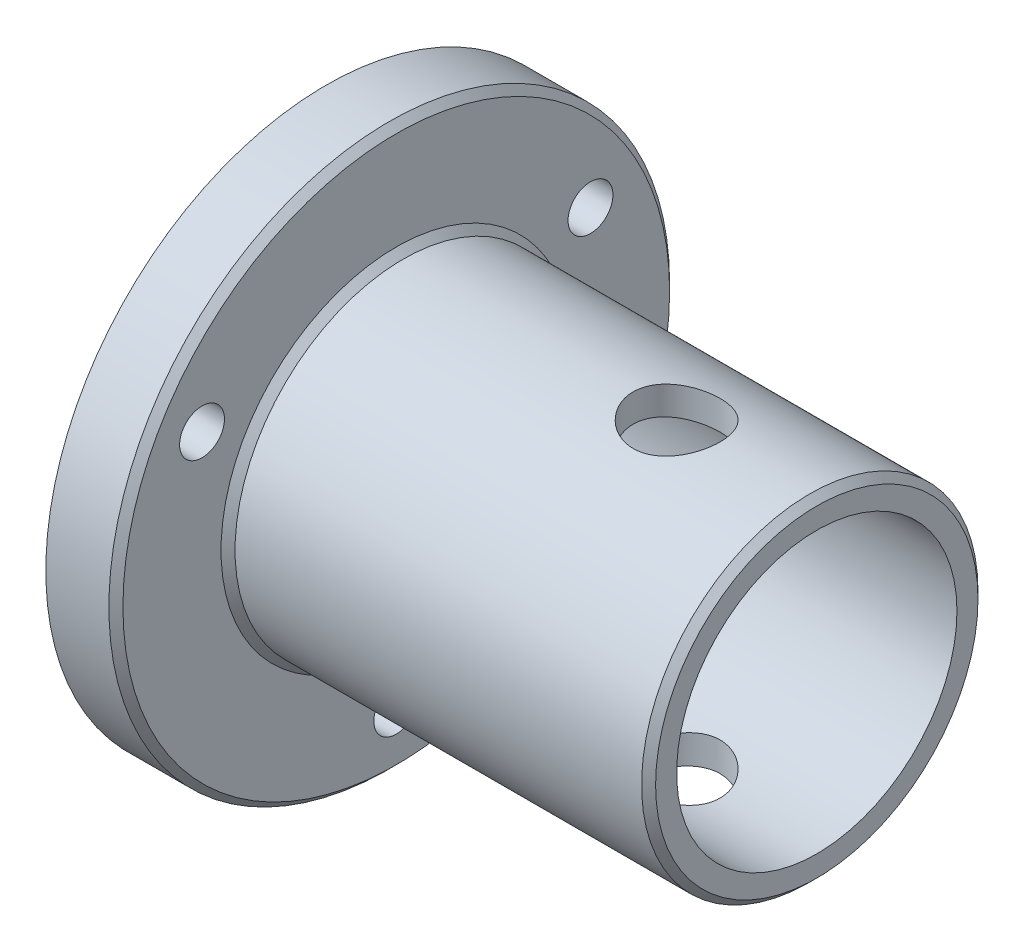
ISO-10303-21;
HEADER;
FILE_DESCRIPTION(('STEP AP214'),'2;1');
FILE_NAME('part.step','',(''),(''),'','','');
FILE_SCHEMA(('AUTOMOTIVE_DESIGN { 1 0 10303 214 1 1 1 1 }'));
ENDSEC;
DATA;
#1=APPLICATION_CONTEXT('core data for automotive mechanical design processes');
#2=APPLICATION_PROTOCOL_DEFINITION('international standard','automotive_design',2000,#1);
#3=PRODUCT_CONTEXT('',#1,'mechanical');
#4=PRODUCT('Part','Part','',(#3));
#5=PRODUCT_RELATED_PRODUCT_CATEGORY('part','',(#4));
#6=PRODUCT_DEFINITION_FORMATION('','',#4);
#7=PRODUCT_DEFINITION_CONTEXT('part definition',#1,'design');
#8=PRODUCT_DEFINITION('design','',#6,#7);
#9=PRODUCT_DEFINITION_SHAPE('','',#8);
#10=(LENGTH_UNIT() NAMED_UNIT(*) SI_UNIT(.MILLI.,.METRE.));
#11=(NAMED_UNIT(*) PLANE_ANGLE_UNIT() SI_UNIT($,.RADIAN.));
#12=(NAMED_UNIT(*) SI_UNIT($,.STERADIAN.) SOLID_ANGLE_UNIT());
#13=UNCERTAINTY_MEASURE_WITH_UNIT(LENGTH_MEASURE(1.E-05),#10,'distance_accuracy_value','');
#14=(GEOMETRIC_REPRESENTATION_CONTEXT(3) GLOBAL_UNCERTAINTY_ASSIGNED_CONTEXT((#13)) GLOBAL_UNIT_ASSIGNED_CONTEXT((#10,
#11,#12)) REPRESENTATION_CONTEXT('',''));
#15=CARTESIAN_POINT('',(0.,0.,0.));
#16=DIRECTION('',(0.,0.,1.));
#17=DIRECTION('',(1.,0.,0.));
#18=AXIS2_PLACEMENT_3D('',#15,#16,#17);
#19=CARTESIAN_POINT('',(35.,0.,0.));
#20=DIRECTION('',(-1.,0.,0.));
#21=DIRECTION('',(0.,0.,1.));
#22=AXIS2_PLACEMENT_3D('',#19,#20,#21);
#23=CYLINDRICAL_SURFACE('',#22,12.);
#24=CARTESIAN_POINT('',(5.50000000000001,0.,0.));
#25=DIRECTION('',(1.,0.,0.));
#26=DIRECTION('',(0.,0.,-1.));
#27=AXIS2_PLACEMENT_3D('',#24,#25,#26);
#28=CIRCLE('',#27,12.);
#29=CARTESIAN_POINT('',(5.50000000000001,0.,-12.));
#30=VERTEX_POINT('',#29);
#31=EDGE_CURVE('E44',#30,#30,#28,.T.);
#32=ORIENTED_EDGE('',*,*,#31,.T.);
#33=EDGE_LOOP('',(#32));
#34=FACE_BOUND('',#33,.T.);
#35=CARTESIAN_POINT('',(34.5,0.,0.));
#36=DIRECTION('',(1.,0.,0.));
#37=DIRECTION('',(0.,0.,-1.));
#38=AXIS2_PLACEMENT_3D('',#35,#36,#37);
#39=CIRCLE('',#38,12.);
#40=CARTESIAN_POINT('',(34.5,0.,-12.));
#41=VERTEX_POINT('',#40);
#42=EDGE_CURVE('E57',#41,#41,#39,.F.);
#43=ORIENTED_EDGE('',*,*,#42,.T.);
#44=EDGE_LOOP('',(#43));
#45=FACE_BOUND('',#44,.T.);
#46=CARTESIAN_POINT('',(25.,-11.5926700979541,-3.1));
#47=CARTESIAN_POINT('',(25.1709812687273,-11.5926732321222,-3.0999954912357));
#48=CARTESIAN_POINT('',(25.3420113313602,-11.5964941540659,-3.08580603872909));
#49=CARTESIAN_POINT('',(25.6791462756398,-11.611322692769,-3.02952201236185));
#50=CARTESIAN_POINT('',(25.8452484356607,-11.6223342063142,-2.9874123075328));
#51=CARTESIAN_POINT('',(26.1676021078596,-11.6502154462981,-2.8767528281645));
#52=CARTESIAN_POINT('',(26.323866564604,-11.6670772760698,-2.80823868019879));
#53=CARTESIAN_POINT('',(26.6227038965771,-11.7047492995837,-2.64682525331377));
#54=CARTESIAN_POINT('',(26.7652759501391,-11.7255597300546,-2.55392451222788));
#55=CARTESIAN_POINT('',(27.0360295916321,-11.7693315191616,-2.34404333029207));
#56=CARTESIAN_POINT('',(27.163842102149,-11.7923291195899,-2.22659423003465));
#57=CARTESIAN_POINT('',(27.3981915312794,-11.8375703908243,-1.97195898842077));
#58=CARTESIAN_POINT('',(27.5047263560674,-11.8598139872542,-1.83477090693754));
#59=CARTESIAN_POINT('',(27.695020595396,-11.9014436748245,-1.54200834198931));
#60=CARTESIAN_POINT('',(27.7784152918266,-11.9207820184585,-1.38618941543748));
#61=CARTESIAN_POINT('',(27.917687075037,-11.954007659976,-1.06216060658955));
#62=CARTESIAN_POINT('',(27.9735685063844,-11.9678958184176,-0.893952685441771));
#63=CARTESIAN_POINT('',(28.0550392473864,-11.9884000367007,-0.553770734206769));
#64=CARTESIAN_POINT('',(28.081255845454,-11.9951664669956,-0.381956155667461));
#65=CARTESIAN_POINT('',(28.1046239856346,-12.001189699885,-0.0362432207716312));
#66=CARTESIAN_POINT('',(28.1017801043448,-12.0004476849492,0.137654803164504));
#67=CARTESIAN_POINT('',(28.0675545353157,-11.9916487016588,0.478240037991099));
#68=CARTESIAN_POINT('',(28.0368502533953,-11.9837653766775,0.645000487656348));
#69=CARTESIAN_POINT('',(27.9488670322867,-11.9617730684823,0.970916767816803));
#70=CARTESIAN_POINT('',(27.8915866268404,-11.9476637417695,1.13007217819233));
#71=CARTESIAN_POINT('',(27.7515433557971,-11.9145431124111,1.43801789833881));
#72=CARTESIAN_POINT('',(27.6685438516611,-11.8954865666526,1.58669552694301));
#73=CARTESIAN_POINT('',(27.4795989672981,-11.8545318437837,1.86824666067749));
#74=CARTESIAN_POINT('',(27.3736493558522,-11.8326331429754,2.00111724451916));
#75=CARTESIAN_POINT('',(27.1381976920348,-11.7876283841855,2.25132438640943));
#76=CARTESIAN_POINT('',(27.0081042125355,-11.7645057211298,2.3681020323851));
#77=CARTESIAN_POINT('',(26.7299394465306,-11.7202333748904,2.57831380162861));
#78=CARTESIAN_POINT('',(26.5818671990644,-11.6990837972746,2.67174667630737));
#79=CARTESIAN_POINT('',(26.270795044652,-11.6610891819864,2.8330075364046));
#80=CARTESIAN_POINT('',(26.1077178096527,-11.6442683584863,2.90069245894728));
#81=CARTESIAN_POINT('',(25.7719576007214,-11.6171413090202,3.00750695874671));
#82=CARTESIAN_POINT('',(25.599276851601,-11.6068335809725,3.04664312037952));
#83=CARTESIAN_POINT('',(25.254416284425,-11.5942174237512,3.09430407740065));
#84=CARTESIAN_POINT('',(25.0823589764788,-11.5916921633405,3.10365887749602));
#85=CARTESIAN_POINT('',(24.7391401147316,-11.5943351499617,3.09377102744816));
#86=CARTESIAN_POINT('',(24.5679784738847,-11.5995026348923,3.07453121010369));
#87=CARTESIAN_POINT('',(24.2345484619628,-11.6167402601914,3.00873001478412));
#88=CARTESIAN_POINT('',(24.0721761697032,-11.6286862698099,2.96265957932974));
#89=CARTESIAN_POINT('',(23.7574610922742,-11.6580153953549,2.84505301580562));
#90=CARTESIAN_POINT('',(23.6051195589164,-11.6753991883511,2.77351371640119));
#91=CARTESIAN_POINT('',(23.3112953954056,-11.7140960291964,2.60528870310117));
#92=CARTESIAN_POINT('',(23.1701043789401,-11.735483254687,2.50811110154685));
#93=CARTESIAN_POINT('',(22.9057284588905,-11.7795988823168,2.2919839065464));
#94=CARTESIAN_POINT('',(22.782546730782,-11.8023275199903,2.1730304818004));
#95=CARTESIAN_POINT('',(22.5542829216208,-11.8473056159507,1.91290429530348));
#96=CARTESIAN_POINT('',(22.4497773110176,-11.86952570636,1.77121961861856));
#97=CARTESIAN_POINT('',(22.2660380700746,-11.9103524913061,1.47183340500616));
#98=CARTESIAN_POINT('',(22.1868031031189,-11.9289593769324,1.31413271578014));
#99=CARTESIAN_POINT('',(22.0565633389923,-11.9603442961819,0.988294681062561));
#100=CARTESIAN_POINT('',(22.0053511266874,-11.9731650294859,0.820244550200718));
#101=CARTESIAN_POINT('',(21.9319975894284,-11.991720545072,0.477545654715656));
#102=CARTESIAN_POINT('',(21.9098502465951,-11.9974567941815,0.302898263761298));
#103=CARTESIAN_POINT('',(21.895612710381,-12.0011325126361,-0.0426369024851989));
#104=CARTESIAN_POINT('',(21.9026743542239,-11.9992920014047,-0.213487900899179));
#105=CARTESIAN_POINT('',(21.9446985165505,-11.9885136629736,-0.551482300379906));
#106=CARTESIAN_POINT('',(21.9796601002656,-11.9795760735567,-0.718625825470205));
#107=CARTESIAN_POINT('',(22.0760243598104,-11.9556466521864,-1.04350746562916));
#108=CARTESIAN_POINT('',(22.1372644025869,-11.9406920931933,-1.20129674565794));
#109=CARTESIAN_POINT('',(22.284301037089,-11.9062979087882,-1.50445044483574));
#110=CARTESIAN_POINT('',(22.3701009020991,-11.8868576856027,-1.64981320444676));
#111=CARTESIAN_POINT('',(22.5663569175467,-11.8449659855827,-1.92797363703745));
#112=CARTESIAN_POINT('',(22.6773821284217,-11.8224507499527,-2.06036019542507));
#113=CARTESIAN_POINT('',(22.9198449996647,-11.7772189294356,-2.30491082042101));
#114=CARTESIAN_POINT('',(23.051287920397,-11.7545022940866,-2.41706965947591));
#115=CARTESIAN_POINT('',(23.3340626625102,-11.7109123351238,-2.62022343696176));
#116=CARTESIAN_POINT('',(23.485743729042,-11.6900857287345,-2.71074311737418));
#117=CARTESIAN_POINT('',(23.8026894353038,-11.653277237802,-2.86486495240525));
#118=CARTESIAN_POINT('',(23.9679445832601,-11.6372920039437,-2.92848572810478));
#119=CARTESIAN_POINT('',(24.2772970390116,-11.614338100382,-3.01809185517792));
#120=CARTESIAN_POINT('',(24.4199805799664,-11.6062759780297,-3.04873795147442));
#121=CARTESIAN_POINT('',(24.7084311240879,-11.5954409014947,-3.0896929427546));
#122=CARTESIAN_POINT('',(24.854197821516,-11.5926674253308,-3.10000384479342));
#123=CARTESIAN_POINT('',(25.,-11.5926700979541,-3.1));
#124=B_SPLINE_CURVE_WITH_KNOTS('',3,(#46,#47,#48,#49,#50,#51,#52,#53,#54,#55,#56,#57,#58,#59,
#60,#61,#62,#63,#64,#65,#66,#67,#68,#69,#70,#71,#72,#73,#74,#75,#76,#77,#78,#79,#80,#81,#82,#83,
#84,#85,#86,#87,#88,#89,#90,#91,#92,#93,#94,#95,#96,#97,#98,#99,#100,#101,#102,#103,#104,#105,
#106,#107,#108,#109,#110,#111,#112,#113,#114,#115,#116,#117,#118,#119,#120,#121,#122,#123),
.UNSPECIFIED.,.T.,.F.,(4,2,2,2,2,2,2,2,2,2,2,2,2,2,2,2,2,2,2,2,2,2,2,2,2,2,2,2,2,2,2,2,2,2,2,2,
2,2,4),(0.,0.512408032707482,1.02509398460181,1.53709059588618,2.0491179123776,2.57199825255387,
3.09493002132231,3.62568797741565,4.15636209562048,4.675591723518,5.19473958166113,
5.70159336892139,6.20847512364484,6.72016653527227,7.2319523658002,7.75850684065091,
8.28508947210651,8.81455663449601,9.34390164398051,9.85835850186142,10.3727643971578,
10.8780410008308,11.3833805426074,11.899226428746,12.4151631616504,12.9449880733492,
13.474784956878,14.000605506698,14.5263171682236,15.0368721362036,15.5474099991034,
16.0548327930151,16.5623232467484,17.0826576071283,17.6031262480937,18.1341484872393,
18.6648025157487,19.1017953096802,19.5387449708773),.UNSPECIFIED.);
#125=CARTESIAN_POINT('',(25.,-11.5926700979541,-3.1));
#126=VERTEX_POINT('',#125);
#127=EDGE_CURVE('E66',#126,#126,#124,.T.);
#128=ORIENTED_EDGE('',*,*,#127,.F.);
#129=EDGE_LOOP('',(#128));
#130=FACE_BOUND('',#129,.T.);
#131=CARTESIAN_POINT('',(25.,11.5926700979541,-3.1));
#132=CARTESIAN_POINT('',(24.8290187312727,11.5926732321222,-3.0999954912357));
#133=CARTESIAN_POINT('',(24.6579886686398,11.5964941540659,-3.08580603872909));
#134=CARTESIAN_POINT('',(24.3208537243602,11.611322692769,-3.02952201236185));
#135=CARTESIAN_POINT('',(24.1547515643393,11.6223342063142,-2.9874123075328));
#136=CARTESIAN_POINT('',(23.8323978921404,11.6502154462981,-2.8767528281645));
#137=CARTESIAN_POINT('',(23.676133435396,11.6670772760698,-2.80823868019879));
#138=CARTESIAN_POINT('',(23.3772961034229,11.7047492995837,-2.64682525331377));
#139=CARTESIAN_POINT('',(23.234724049861,11.7255597300546,-2.55392451222788));
#140=CARTESIAN_POINT('',(22.9639704083679,11.7693315191616,-2.34404333029207));
#141=CARTESIAN_POINT('',(22.836157897851,11.7923291195899,-2.22659423003465));
#142=CARTESIAN_POINT('',(22.6018084687206,11.8375703908244,-1.97195898842076));
#143=CARTESIAN_POINT('',(22.4952736439326,11.8598139872542,-1.83477090693754));
#144=CARTESIAN_POINT('',(22.304979404604,11.9014436748245,-1.54200834198931));
#145=CARTESIAN_POINT('',(22.2215847081734,11.9207820184585,-1.38618941543748));
#146=CARTESIAN_POINT('',(22.082312924963,11.954007659976,-1.06216060658955));
#147=CARTESIAN_POINT('',(22.0264314936156,11.9678958184176,-0.893952685441771));
#148=CARTESIAN_POINT('',(21.9449607526136,11.9884000367007,-0.553770734206769));
#149=CARTESIAN_POINT('',(21.918744154546,11.9951664669956,-0.381956155667461));
#150=CARTESIAN_POINT('',(21.8953760143654,12.001189699885,-0.0362432207716312));
#151=CARTESIAN_POINT('',(21.8982198956552,12.0004476849492,0.137654803164504));
#152=CARTESIAN_POINT('',(21.9324454646843,11.9916487016588,0.478240037991099));
#153=CARTESIAN_POINT('',(21.9631497466047,11.9837653766775,0.645000487656348));
#154=CARTESIAN_POINT('',(22.0511329677133,11.9617730684823,0.970916767816803));
#155=CARTESIAN_POINT('',(22.1084133731596,11.9476637417695,1.13007217819233));
#156=CARTESIAN_POINT('',(22.2484566442029,11.9145431124111,1.43801789833881));
#157=CARTESIAN_POINT('',(22.3314561483389,11.8954865666526,1.58669552694301));
#158=CARTESIAN_POINT('',(22.5204010327019,11.8545318437837,1.86824666067749));
#159=CARTESIAN_POINT('',(22.6263506441478,11.8326331429754,2.00111724451916));
#160=CARTESIAN_POINT('',(22.8618023079652,11.7876283841855,2.25132438640943));
#161=CARTESIAN_POINT('',(22.9918957874645,11.7645057211298,2.3681020323851));
#162=CARTESIAN_POINT('',(23.2700605534694,11.7202333748904,2.57831380162861));
#163=CARTESIAN_POINT('',(23.4181328009356,11.6990837972746,2.67174667630737));
#164=CARTESIAN_POINT('',(23.729204955348,11.6610891819864,2.8330075364046));
#165=CARTESIAN_POINT('',(23.8922821903473,11.6442683584863,2.90069245894728));
#166=CARTESIAN_POINT('',(24.2280423992787,11.6171413090202,3.00750695874672));
#167=CARTESIAN_POINT('',(24.400723148399,11.6068335809725,3.04664312037952));
#168=CARTESIAN_POINT('',(24.745583715575,11.5942174237512,3.09430407740065));
#169=CARTESIAN_POINT('',(24.9176410235212,11.5916921633405,3.10365887749602));
#170=CARTESIAN_POINT('',(25.2608598852684,11.5943351499617,3.09377102744816));
#171=CARTESIAN_POINT('',(25.4320215261153,11.5995026348923,3.07453121010369));
#172=CARTESIAN_POINT('',(25.7654515380372,11.6167402601914,3.00873001478412));
#173=CARTESIAN_POINT('',(25.9278238302968,11.6286862698099,2.96265957932974));
#174=CARTESIAN_POINT('',(26.2425389077258,11.6580153953549,2.84505301580562));
#175=CARTESIAN_POINT('',(26.3948804410836,11.6753991883511,2.77351371640119));
#176=CARTESIAN_POINT('',(26.6887046045944,11.7140960291964,2.60528870310117));
#177=CARTESIAN_POINT('',(26.8298956210599,11.735483254687,2.50811110154685));
#178=CARTESIAN_POINT('',(27.0942715411095,11.7795988823168,2.2919839065464));
#179=CARTESIAN_POINT('',(27.217453269218,11.8023275199903,2.1730304818004));
#180=CARTESIAN_POINT('',(27.4457170783792,11.8473056159507,1.91290429530348));
#181=CARTESIAN_POINT('',(27.5502226889824,11.86952570636,1.77121961861856));
#182=CARTESIAN_POINT('',(27.7339619299254,11.9103524913061,1.47183340500616));
#183=CARTESIAN_POINT('',(27.8131968968811,11.9289593769324,1.31413271578014));
#184=CARTESIAN_POINT('',(27.9434366610077,11.9603442961819,0.98829468106256));
#185=CARTESIAN_POINT('',(27.9946488733126,11.9731650294859,0.820244550200718));
#186=CARTESIAN_POINT('',(28.0680024105716,11.991720545072,0.477545654715656));
#187=CARTESIAN_POINT('',(28.0901497534049,11.9974567941815,0.302898263761298));
#188=CARTESIAN_POINT('',(28.104387289619,12.0011325126361,-0.0426369024851988));
#189=CARTESIAN_POINT('',(28.0973256457761,11.9992920014047,-0.213487900899178));
#190=CARTESIAN_POINT('',(28.0553014834495,11.9885136629736,-0.551482300379906));
#191=CARTESIAN_POINT('',(28.0203398997344,11.9795760735567,-0.718625825470205));
#192=CARTESIAN_POINT('',(27.9239756401896,11.9556466521864,-1.04350746562916));
#193=CARTESIAN_POINT('',(27.8627355974131,11.9406920931933,-1.20129674565794));
#194=CARTESIAN_POINT('',(27.715698962911,11.9062979087882,-1.50445044483574));
#195=CARTESIAN_POINT('',(27.6298990979009,11.8868576856027,-1.64981320444676));
#196=CARTESIAN_POINT('',(27.4336430824533,11.8449659855827,-1.92797363703745));
#197=CARTESIAN_POINT('',(27.3226178715783,11.8224507499527,-2.06036019542507));
#198=CARTESIAN_POINT('',(27.0801550003353,11.7772189294356,-2.30491082042101));
#199=CARTESIAN_POINT('',(26.948712079603,11.7545022940866,-2.41706965947591));
#200=CARTESIAN_POINT('',(26.6659373374898,11.7109123351238,-2.62022343696176));
#201=CARTESIAN_POINT('',(26.514256270958,11.6900857287345,-2.71074311737418));
#202=CARTESIAN_POINT('',(26.1973105646962,11.653277237802,-2.86486495240525));
#203=CARTESIAN_POINT('',(26.0320554167399,11.6372920039437,-2.92848572810478));
#204=CARTESIAN_POINT('',(25.7227029609884,11.614338100382,-3.01809185517792));
#205=CARTESIAN_POINT('',(25.5800194200336,11.6062759780297,-3.04873795147442));
#206=CARTESIAN_POINT('',(25.2915688759121,11.5954409014947,-3.0896929427546));
#207=CARTESIAN_POINT('',(25.145802178484,11.5926674253308,-3.10000384479342));
#208=CARTESIAN_POINT('',(25.,11.5926700979541,-3.1));
#209=B_SPLINE_CURVE_WITH_KNOTS('',3,(#131,#132,#133,#134,#135,#136,#137,#138,#139,#140,#141,
#142,#143,#144,#145,#146,#147,#148,#149,#150,#151,#152,#153,#154,#155,#156,#157,#158,#159,#160,
#161,#162,#163,#164,#165,#166,#167,#168,#169,#170,#171,#172,#173,#174,#175,#176,#177,#178,#179,
#180,#181,#182,#183,#184,#185,#186,#187,#188,#189,#190,#191,#192,#193,#194,#195,#196,#197,#198,
#199,#200,#201,#202,#203,#204,#205,#206,#207,#208),.UNSPECIFIED.,.T.,.F.,(4,2,2,2,2,2,2,2,2,2,2,
2,2,2,2,2,2,2,2,2,2,2,2,2,2,2,2,2,2,2,2,2,2,2,2,2,2,2,4),(0.,0.512408032707482,1.02509398460181,
1.53709059588618,2.0491179123776,2.57199825255387,3.09493002132231,3.62568797741565,
4.15636209562048,4.675591723518,5.19473958166113,5.70159336892139,6.20847512364484,
6.72016653527227,7.2319523658002,7.75850684065091,8.28508947210651,8.81455663449601,
9.34390164398051,9.85835850186142,10.3727643971578,10.8780410008308,11.3833805426074,
11.899226428746,12.4151631616504,12.9449880733492,13.474784956878,14.000605506698,
14.5263171682236,15.0368721362036,15.5474099991034,16.0548327930151,16.5623232467484,
17.0826576071283,17.6031262480937,18.1341484872393,18.6648025157487,19.1017953096802,
19.5387449708773),.UNSPECIFIED.);
#210=CARTESIAN_POINT('',(25.,11.5926700979541,-3.1));
#211=VERTEX_POINT('',#210);
#212=EDGE_CURVE('E97',#211,#211,#209,.T.);
#213=ORIENTED_EDGE('',*,*,#212,.F.);
#214=EDGE_LOOP('',(#213));
#215=FACE_BOUND('',#214,.T.);
#216=ADVANCED_FACE('F36',(#34,#45,#130,#215),#23,.T.);
#217=CARTESIAN_POINT('',(5.,0.,0.));
#218=DIRECTION('',(1.,0.,0.));
#219=DIRECTION('',(0.,0.,-1.));
#220=AXIS2_PLACEMENT_3D('',#217,#218,#219);
#221=CYLINDRICAL_SURFACE('',#220,10.);
#222=CARTESIAN_POINT('',(5.,0.,0.));
#223=DIRECTION('',(1.,0.,0.));
#224=DIRECTION('',(0.,0.,-1.));
#225=AXIS2_PLACEMENT_3D('',#222,#223,#224);
#226=CIRCLE('',#225,10.);
#227=CARTESIAN_POINT('',(5.,0.,-10.));
#228=VERTEX_POINT('',#227);
#229=EDGE_CURVE('E146',#228,#228,#226,.T.);
#230=ORIENTED_EDGE('',*,*,#229,.F.);
#231=EDGE_LOOP('',(#230));
#232=FACE_BOUND('',#231,.T.);
#233=CARTESIAN_POINT('',(35.,0.,0.));
#234=DIRECTION('',(1.,0.,0.));
#235=DIRECTION('',(0.,0.,-1.));
#236=AXIS2_PLACEMENT_3D('',#233,#234,#235);
#237=CIRCLE('',#236,10.);
#238=CARTESIAN_POINT('',(35.,0.,-10.));
#239=VERTEX_POINT('',#238);
#240=EDGE_CURVE('E151',#239,#239,#237,.T.);
#241=ORIENTED_EDGE('',*,*,#240,.T.);
#242=EDGE_LOOP('',(#241));
#243=FACE_BOUND('',#242,.T.);
#244=CARTESIAN_POINT('',(25.,-9.50736556570746,-3.1));
#245=CARTESIAN_POINT('',(24.8304244514845,-9.50736676636624,-3.09999864890097));
#246=CARTESIAN_POINT('',(24.6608353638769,-9.51195208830857,-3.08603861369875));
#247=CARTESIAN_POINT('',(24.3266345648745,-9.52971845612583,-3.03072383584299));
#248=CARTESIAN_POINT('',(24.1620242759342,-9.54290193468915,-2.98936134012092));
#249=CARTESIAN_POINT('',(23.8426696680156,-9.57623105585536,-2.88079656231542));
#250=CARTESIAN_POINT('',(23.6879086532523,-9.59636452373633,-2.81363944322435));
#251=CARTESIAN_POINT('',(23.3918080941752,-9.64130826344982,-2.65554200648056));
#252=CARTESIAN_POINT('',(23.2504708544958,-9.66611933617294,-2.56459761498185));
#253=CARTESIAN_POINT('',(22.9804524169825,-9.71856332456026,-2.3582152784556));
#254=CARTESIAN_POINT('',(22.8522917967972,-9.74625941519738,-2.24211213476881));
#255=CARTESIAN_POINT('',(22.6169123906239,-9.80081480803843,-1.99013186884194));
#256=CARTESIAN_POINT('',(22.5096964805831,-9.82767399490095,-1.8542520355008));
#257=CARTESIAN_POINT('',(22.316960214455,-9.87825089481637,-1.56284223211642));
#258=CARTESIAN_POINT('',(22.2319748921441,-9.90188553940508,-1.4069427119225));
#259=CARTESIAN_POINT('',(22.0896328964329,-9.94261339925288,-1.08220611895481));
#260=CARTESIAN_POINT('',(22.0322698382584,-9.95970812599949,-0.91337204641846));
#261=CARTESIAN_POINT('',(21.9485357387293,-9.98498290620197,-0.573008728898471));
#262=CARTESIAN_POINT('',(21.9212751804425,-9.99341827405358,-0.401717622303923));
#263=CARTESIAN_POINT('',(21.8957027029057,-10.0013250976492,-0.0567990203013562));
#264=CARTESIAN_POINT('',(21.8973843047904,-10.0007985595665,0.116827943516292));
#265=CARTESIAN_POINT('',(21.9290608362799,-9.99101922016058,0.45523318448751));
#266=CARTESIAN_POINT('',(21.9580916942508,-9.98206355851277,0.620111658831163));
#267=CARTESIAN_POINT('',(22.0420622226447,-9.95679681576947,0.942529368401117));
#268=CARTESIAN_POINT('',(22.0970035735375,-9.9404852575976,1.10006812686915));
#269=CARTESIAN_POINT('',(22.2318616703147,-9.90193821347155,1.40557246813736));
#270=CARTESIAN_POINT('',(22.312073129668,-9.87963330635494,1.55339883589298));
#271=CARTESIAN_POINT('',(22.494958787661,-9.83145285138935,1.8337950617162));
#272=CARTESIAN_POINT('',(22.597638596885,-9.80557641228811,1.96636109647696));
#273=CARTESIAN_POINT('',(22.8275061602153,-9.75175679512367,2.21822324356431));
#274=CARTESIAN_POINT('',(22.9555268093493,-9.72377238141297,2.33675143365647));
#275=CARTESIAN_POINT('',(23.2298919929714,-9.66980979728555,2.55088299282151));
#276=CARTESIAN_POINT('',(23.3762386118776,-9.64383185563169,2.64648375048882));
#277=CARTESIAN_POINT('',(23.6852410888133,-9.59661771882306,2.81292114020214));
#278=CARTESIAN_POINT('',(23.8480566467053,-9.57543601886212,2.88347788248684));
#279=CARTESIAN_POINT('',(24.1840719825087,-9.54085330949264,2.99593384704186));
#280=CARTESIAN_POINT('',(24.3572680764395,-9.52744955757276,3.03784317134583));
#281=CARTESIAN_POINT('',(24.7017806293707,-9.51054773693131,3.09034251748383));
#282=CARTESIAN_POINT('',(24.8729000647788,-9.50667852853345,3.1021067271008));
#283=CARTESIAN_POINT('',(25.2146782505747,-9.50825428642433,3.0972746970036));
#284=CARTESIAN_POINT('',(25.3853370668383,-9.51369784148448,3.08068275429718));
#285=CARTESIAN_POINT('',(25.7163266561541,-9.53291978853358,3.0206580353127));
#286=CARTESIAN_POINT('',(25.876813040616,-9.54645785779539,2.9779984230715));
#287=CARTESIAN_POINT('',(26.1883337125366,-9.5800899524026,2.86795478334852));
#288=CARTESIAN_POINT('',(26.3393664701062,-9.60018503562314,2.80056676609347));
#289=CARTESIAN_POINT('',(26.6324238943357,-9.64537341241102,2.64080106837511));
#290=CARTESIAN_POINT('',(26.7740724801361,-9.67059210343362,2.54776992017527));
#291=CARTESIAN_POINT('',(27.0401758143504,-9.72292459768052,2.34012430484114));
#292=CARTESIAN_POINT('',(27.164626153069,-9.75003888426889,2.22550431998356));
#293=CARTESIAN_POINT('',(27.3980222671859,-9.80444240119515,1.97238630338188));
#294=CARTESIAN_POINT('',(27.5061312223507,-9.83169386622825,1.83310650986774));
#295=CARTESIAN_POINT('',(27.6974727738048,-9.88219703725533,1.53772505697807));
#296=CARTESIAN_POINT('',(27.7807065319296,-9.90544893003414,1.3816241837213));
#297=CARTESIAN_POINT('',(27.919134796939,-9.94519819292712,1.05800912996467));
#298=CARTESIAN_POINT('',(27.9745339014676,-9.96174467138602,0.890588809191828));
#299=CARTESIAN_POINT('',(28.0562099768921,-9.98643498855168,0.548205229960644));
#300=CARTESIAN_POINT('',(28.0824959013467,-9.99458141058493,0.3732443077696));
#301=CARTESIAN_POINT('',(28.1044814671859,-10.0013853824155,0.0284551538653176));
#302=CARTESIAN_POINT('',(28.1013908099765,-10.0004182354368,-0.141289457313184));
#303=CARTESIAN_POINT('',(28.067629528331,-9.98999976757164,-0.477732405013065));
#304=CARTESIAN_POINT('',(28.0369606535165,-9.98054898490547,-0.644430934099944));
#305=CARTESIAN_POINT('',(27.9496795455788,-9.95434153847421,-0.968064964317696));
#306=CARTESIAN_POINT('',(27.8933867294188,-9.93767494532364,-1.12509440878578));
#307=CARTESIAN_POINT('',(27.7567435794203,-9.89875549252942,-1.42755666362608));
#308=CARTESIAN_POINT('',(27.6763891516625,-9.87650168236303,-1.57298749523682));
#309=CARTESIAN_POINT('',(27.490785188478,-9.82780452302839,-1.85343048190947));
#310=CARTESIAN_POINT('',(27.3847910765668,-9.80124569242192,-1.98792960743176));
#311=CARTESIAN_POINT('',(27.1522353196099,-9.74727365130231,-2.23763443627727));
#312=CARTESIAN_POINT('',(27.0256675678846,-9.71986018907547,-2.35283439053035));
#313=CARTESIAN_POINT('',(26.7506334396836,-9.666228451726,-2.56443933819458));
#314=CARTESIAN_POINT('',(26.6015897494447,-9.64007782242423,-2.66011316854785));
#315=CARTESIAN_POINT('',(26.2887575707126,-9.59307344394776,-2.82494766900962));
#316=CARTESIAN_POINT('',(26.1249753139196,-9.57221747022905,-2.89411948015454));
#317=CARTESIAN_POINT('',(25.8024548764884,-9.5399451366621,-2.99869526124161));
#318=CARTESIAN_POINT('',(25.6445851735187,-9.52784912196116,-3.03657438236825));
#319=CARTESIAN_POINT('',(25.3244804173845,-9.51155969647857,-3.08722442937452));
#320=CARTESIAN_POINT('',(25.1622464057173,-9.50736441694178,-3.10000129270383));
#321=CARTESIAN_POINT('',(25.,-9.50736556570746,-3.1));
#322=B_SPLINE_CURVE_WITH_KNOTS('',3,(#244,#245,#246,#247,#248,#249,#250,#251,#252,#253,#254,
#255,#256,#257,#258,#259,#260,#261,#262,#263,#264,#265,#266,#267,#268,#269,#270,#271,#272,#273,
#274,#275,#276,#277,#278,#279,#280,#281,#282,#283,#284,#285,#286,#287,#288,#289,#290,#291,#292,
#293,#294,#295,#296,#297,#298,#299,#300,#301,#302,#303,#304,#305,#306,#307,#308,#309,#310,#311,
#312,#313,#314,#315,#316,#317,#318,#319,#320,#321),.UNSPECIFIED.,.T.,.F.,(4,2,2,2,2,2,2,2,2,2,2,
2,2,2,2,2,2,2,2,2,2,2,2,2,2,2,2,2,2,2,2,2,2,2,2,2,2,2,4),(0.,0.508127484507295,1.01639879663347,
1.52378421957181,2.03125659510419,2.55428048966281,3.07737615095993,3.61209545309212,
4.14669109762864,4.66502779874302,5.18324846878218,5.68385921453387,6.18450243272816,
6.69121518852718,7.19805462054027,7.72569570997921,8.25339686855992,8.78682249617941,
9.32005992298397,9.83218754771353,10.3442375730134,10.8417914192469,11.3394255779988,
11.8511482041754,12.3630017954766,12.8956805147702,13.4283343505677,13.9570134573076,
14.4855299272299,14.9923800021415,15.4991979236582,15.9998641271725,16.5006155640799,
17.0181618911841,17.5358621181428,18.0703609437859,18.6046348272529,19.090915813556,
19.5770817657183),.UNSPECIFIED.);
#323=CARTESIAN_POINT('',(25.,-9.50736556570746,-3.1));
#324=VERTEX_POINT('',#323);
#325=EDGE_CURVE('E67',#324,#324,#322,.T.);
#326=ORIENTED_EDGE('',*,*,#325,.F.);
#327=EDGE_LOOP('',(#326));
#328=FACE_BOUND('',#327,.T.);
#329=CARTESIAN_POINT('',(25.,9.50736556570746,-3.1));
#330=CARTESIAN_POINT('',(25.1695755485155,9.50736676636624,-3.09999864890097));
#331=CARTESIAN_POINT('',(25.3391646361231,9.51195208830857,-3.08603861369875));
#332=CARTESIAN_POINT('',(25.6733654351255,9.52971845612583,-3.03072383584299));
#333=CARTESIAN_POINT('',(25.8379757240658,9.54290193468915,-2.98936134012092));
#334=CARTESIAN_POINT('',(26.1573303319844,9.57623105585536,-2.88079656231542));
#335=CARTESIAN_POINT('',(26.3120913467477,9.59636452373633,-2.81363944322435));
#336=CARTESIAN_POINT('',(26.6081919058248,9.64130826344982,-2.65554200648056));
#337=CARTESIAN_POINT('',(26.7495291455042,9.66611933617294,-2.56459761498185));
#338=CARTESIAN_POINT('',(27.0195475830175,9.71856332456026,-2.3582152784556));
#339=CARTESIAN_POINT('',(27.1477082032028,9.74625941519738,-2.24211213476881));
#340=CARTESIAN_POINT('',(27.3830876093761,9.80081480803843,-1.99013186884194));
#341=CARTESIAN_POINT('',(27.4903035194169,9.82767399490095,-1.8542520355008));
#342=CARTESIAN_POINT('',(27.683039785545,9.87825089481637,-1.56284223211642));
#343=CARTESIAN_POINT('',(27.7680251078559,9.90188553940508,-1.4069427119225));
#344=CARTESIAN_POINT('',(27.9103671035671,9.94261339925288,-1.08220611895481));
#345=CARTESIAN_POINT('',(27.9677301617416,9.95970812599949,-0.91337204641846));
#346=CARTESIAN_POINT('',(28.0514642612707,9.98498290620197,-0.573008728898471));
#347=CARTESIAN_POINT('',(28.0787248195575,9.99341827405358,-0.401717622303923));
#348=CARTESIAN_POINT('',(28.1042972970943,10.0013250976492,-0.0567990203013562));
#349=CARTESIAN_POINT('',(28.1026156952096,10.0007985595665,0.116827943516292));
#350=CARTESIAN_POINT('',(28.0709391637201,9.99101922016058,0.45523318448751));
#351=CARTESIAN_POINT('',(28.0419083057492,9.98206355851277,0.620111658831163));
#352=CARTESIAN_POINT('',(27.9579377773553,9.95679681576947,0.942529368401117));
#353=CARTESIAN_POINT('',(27.9029964264625,9.9404852575976,1.10006812686915));
#354=CARTESIAN_POINT('',(27.7681383296853,9.90193821347155,1.40557246813736));
#355=CARTESIAN_POINT('',(27.687926870332,9.87963330635494,1.55339883589298));
#356=CARTESIAN_POINT('',(27.505041212339,9.83145285138935,1.8337950617162));
#357=CARTESIAN_POINT('',(27.4023614031151,9.80557641228811,1.96636109647696));
#358=CARTESIAN_POINT('',(27.1724938397847,9.75175679512367,2.21822324356431));
#359=CARTESIAN_POINT('',(27.0444731906507,9.72377238141297,2.33675143365647));
#360=CARTESIAN_POINT('',(26.7701080070286,9.66980979728555,2.55088299282151));
#361=CARTESIAN_POINT('',(26.6237613881224,9.64383185563169,2.64648375048882));
#362=CARTESIAN_POINT('',(26.3147589111867,9.59661771882306,2.81292114020214));
#363=CARTESIAN_POINT('',(26.1519433532947,9.57543601886212,2.88347788248684));
#364=CARTESIAN_POINT('',(25.8159280174913,9.54085330949264,2.99593384704186));
#365=CARTESIAN_POINT('',(25.6427319235605,9.52744955757275,3.03784317134583));
#366=CARTESIAN_POINT('',(25.2982193706293,9.51054773693131,3.09034251748383));
#367=CARTESIAN_POINT('',(25.1270999352212,9.50667852853345,3.1021067271008));
#368=CARTESIAN_POINT('',(24.7853217494254,9.50825428642433,3.0972746970036));
#369=CARTESIAN_POINT('',(24.6146629331617,9.51369784148448,3.08068275429718));
#370=CARTESIAN_POINT('',(24.2836733438459,9.53291978853358,3.0206580353127));
#371=CARTESIAN_POINT('',(24.123186959384,9.54645785779539,2.9779984230715));
#372=CARTESIAN_POINT('',(23.8116662874634,9.5800899524026,2.86795478334852));
#373=CARTESIAN_POINT('',(23.6606335298938,9.60018503562314,2.80056676609347));
#374=CARTESIAN_POINT('',(23.3675761056643,9.64537341241102,2.64080106837511));
#375=CARTESIAN_POINT('',(23.2259275198639,9.67059210343362,2.54776992017527));
#376=CARTESIAN_POINT('',(22.9598241856496,9.72292459768052,2.34012430484114));
#377=CARTESIAN_POINT('',(22.835373846931,9.75003888426889,2.22550431998355));
#378=CARTESIAN_POINT('',(22.6019777328141,9.80444240119515,1.97238630338188));
#379=CARTESIAN_POINT('',(22.4938687776493,9.83169386622826,1.83310650986774));
#380=CARTESIAN_POINT('',(22.3025272261952,9.88219703725533,1.53772505697807));
#381=CARTESIAN_POINT('',(22.2192934680704,9.90544893003414,1.3816241837213));
#382=CARTESIAN_POINT('',(22.080865203061,9.94519819292712,1.05800912996467));
#383=CARTESIAN_POINT('',(22.0254660985324,9.96174467138602,0.890588809191829));
#384=CARTESIAN_POINT('',(21.9437900231079,9.98643498855168,0.548205229960645));
#385=CARTESIAN_POINT('',(21.9175040986533,9.99458141058493,0.373244307769601));
#386=CARTESIAN_POINT('',(21.8955185328141,10.0013853824155,0.0284551538653175));
#387=CARTESIAN_POINT('',(21.8986091900235,10.0004182354368,-0.141289457313184));
#388=CARTESIAN_POINT('',(21.932370471669,9.98999976757164,-0.477732405013065));
#389=CARTESIAN_POINT('',(21.9630393464835,9.98054898490547,-0.644430934099944));
#390=CARTESIAN_POINT('',(22.0503204544212,9.95434153847421,-0.968064964317696));
#391=CARTESIAN_POINT('',(22.1066132705812,9.93767494532364,-1.12509440878578));
#392=CARTESIAN_POINT('',(22.2432564205797,9.89875549252942,-1.42755666362608));
#393=CARTESIAN_POINT('',(22.3236108483375,9.87650168236303,-1.57298749523682));
#394=CARTESIAN_POINT('',(22.509214811522,9.82780452302839,-1.85343048190947));
#395=CARTESIAN_POINT('',(22.6152089234332,9.80124569242192,-1.98792960743176));
#396=CARTESIAN_POINT('',(22.8477646803901,9.74727365130231,-2.23763443627727));
#397=CARTESIAN_POINT('',(22.9743324321154,9.71986018907547,-2.35283439053035));
#398=CARTESIAN_POINT('',(23.2493665603164,9.666228451726,-2.56443933819458));
#399=CARTESIAN_POINT('',(23.3984102505553,9.64007782242423,-2.66011316854785));
#400=CARTESIAN_POINT('',(23.7112424292874,9.59307344394776,-2.82494766900962));
#401=CARTESIAN_POINT('',(23.8750246860804,9.57221747022905,-2.89411948015454));
#402=CARTESIAN_POINT('',(24.1975451235116,9.5399451366621,-2.99869526124161));
#403=CARTESIAN_POINT('',(24.3554148264813,9.52784912196116,-3.03657438236825));
#404=CARTESIAN_POINT('',(24.6755195826155,9.51155969647857,-3.08722442937452));
#405=CARTESIAN_POINT('',(24.8377535942827,9.50736441694178,-3.10000129270383));
#406=CARTESIAN_POINT('',(25.,9.50736556570746,-3.1));
#407=B_SPLINE_CURVE_WITH_KNOTS('',3,(#329,#330,#331,#332,#333,#334,#335,#336,#337,#338,#339,
#340,#341,#342,#343,#344,#345,#346,#347,#348,#349,#350,#351,#352,#353,#354,#355,#356,#357,#358,
#359,#360,#361,#362,#363,#364,#365,#366,#367,#368,#369,#370,#371,#372,#373,#374,#375,#376,#377,
#378,#379,#380,#381,#382,#383,#384,#385,#386,#387,#388,#389,#390,#391,#392,#393,#394,#395,#396,
#397,#398,#399,#400,#401,#402,#403,#404,#405,#406),.UNSPECIFIED.,.T.,.F.,(4,2,2,2,2,2,2,2,2,2,2,
2,2,2,2,2,2,2,2,2,2,2,2,2,2,2,2,2,2,2,2,2,2,2,2,2,2,2,4),(0.,0.508127484507295,1.01639879663347,
1.52378421957181,2.03125659510419,2.55428048966281,3.07737615095993,3.61209545309212,
4.14669109762864,4.66502779874302,5.18324846878218,5.68385921453387,6.18450243272816,
6.69121518852718,7.19805462054027,7.72569570997921,8.25339686855992,8.78682249617941,
9.32005992298397,9.83218754771353,10.3442375730134,10.8417914192469,11.3394255779988,
11.8511482041754,12.3630017954766,12.8956805147702,13.4283343505677,13.9570134573076,
14.4855299272299,14.9923800021415,15.4991979236582,15.9998641271725,16.5006155640799,
17.0181618911841,17.5358621181428,18.0703609437859,18.6046348272529,19.090915813556,
19.5770817657183),.UNSPECIFIED.);
#408=CARTESIAN_POINT('',(25.,9.50736556570746,-3.1));
#409=VERTEX_POINT('',#408);
#410=EDGE_CURVE('E58',#409,#409,#407,.T.);
#411=ORIENTED_EDGE('',*,*,#410,.F.);
#412=EDGE_LOOP('',(#411));
#413=FACE_BOUND('',#412,.T.);
#414=ADVANCED_FACE('F72',(#232,#243,#328,#413),#221,.F.);
#415=CARTESIAN_POINT('',(5.,0.,0.));
#416=DIRECTION('',(-1.,0.,0.));
#417=DIRECTION('',(0.,0.,1.));
#418=AXIS2_PLACEMENT_3D('',#415,#416,#417);
#419=CYLINDRICAL_SURFACE('',#418,20.);
#420=CARTESIAN_POINT('',(4.5,0.,0.));
#421=DIRECTION('',(1.,0.,0.));
#422=DIRECTION('',(0.,0.,-1.));
#423=AXIS2_PLACEMENT_3D('',#420,#421,#422);
#424=CIRCLE('',#423,20.);
#425=CARTESIAN_POINT('',(4.5,0.,-20.));
#426=VERTEX_POINT('',#425);
#427=EDGE_CURVE('E48',#426,#426,#424,.F.);
#428=ORIENTED_EDGE('',*,*,#427,.T.);
#429=EDGE_LOOP('',(#428));
#430=FACE_BOUND('',#429,.T.);
#431=CARTESIAN_POINT('',(0.,0.,0.));
#432=DIRECTION('',(1.,0.,0.));
#433=DIRECTION('',(0.,0.,-1.));
#434=AXIS2_PLACEMENT_3D('',#431,#432,#433);
#435=CIRCLE('',#434,20.);
#436=CARTESIAN_POINT('',(0.,0.,-20.));
#437=VERTEX_POINT('',#436);
#438=EDGE_CURVE('E143',#437,#437,#435,.T.);
#439=ORIENTED_EDGE('',*,*,#438,.T.);
#440=EDGE_LOOP('',(#439));
#441=FACE_BOUND('',#440,.T.);
#442=ADVANCED_FACE('F113',(#430,#441),#419,.T.);
#443=CARTESIAN_POINT('',(5.,0.,0.));
#444=DIRECTION('',(1.,0.,0.));
#445=DIRECTION('',(0.,0.,-1.));
#446=AXIS2_PLACEMENT_3D('',#443,#444,#445);
#447=PLANE('',#446);
#448=CARTESIAN_POINT('',(5.,8.,-13.856406460551));
#449=DIRECTION('',(1.,0.,0.));
#450=DIRECTION('',(0.,0.,-1.));
#451=AXIS2_PLACEMENT_3D('',#448,#449,#450);
#452=CIRCLE('',#451,1.6);
#453=CARTESIAN_POINT('',(5.,8.,-15.456406460551));
#454=VERTEX_POINT('',#453);
#455=EDGE_CURVE('E98',#454,#454,#452,.T.);
#456=ORIENTED_EDGE('',*,*,#455,.F.);
#457=EDGE_LOOP('',(#456));
#458=FACE_BOUND('',#457,.T.);
#459=CARTESIAN_POINT('',(5.,8.,13.856406460551));
#460=DIRECTION('',(1.,0.,0.));
#461=DIRECTION('',(0.,0.,-1.));
#462=AXIS2_PLACEMENT_3D('',#459,#460,#461);
#463=CIRCLE('',#462,1.6);
#464=CARTESIAN_POINT('',(5.,8.,12.256406460551));
#465=VERTEX_POINT('',#464);
#466=EDGE_CURVE('E178',#465,#465,#463,.T.);
#467=ORIENTED_EDGE('',*,*,#466,.F.);
#468=EDGE_LOOP('',(#467));
#469=FACE_BOUND('',#468,.T.);
#470=CARTESIAN_POINT('',(5.,-16.,0.));
#471=DIRECTION('',(1.,0.,0.));
#472=DIRECTION('',(0.,0.,-1.));
#473=AXIS2_PLACEMENT_3D('',#470,#471,#472);
#474=CIRCLE('',#473,1.59999999999999);
#475=CARTESIAN_POINT('',(5.,-16.,-1.59999999999999));
#476=VERTEX_POINT('',#475);
#477=EDGE_CURVE('E182',#476,#476,#474,.T.);
#478=ORIENTED_EDGE('',*,*,#477,.F.);
#479=EDGE_LOOP('',(#478));
#480=FACE_BOUND('',#479,.T.);
#481=CARTESIAN_POINT('',(5.,0.,0.));
#482=DIRECTION('',(1.,0.,0.));
#483=DIRECTION('',(0.,0.,-1.));
#484=AXIS2_PLACEMENT_3D('',#481,#482,#483);
#485=CIRCLE('',#484,12.5);
#486=CARTESIAN_POINT('',(5.,0.,-12.5));
#487=VERTEX_POINT('',#486);
#488=EDGE_CURVE('E10',#487,#487,#485,.F.);
#489=ORIENTED_EDGE('',*,*,#488,.T.);
#490=EDGE_LOOP('',(#489));
#491=FACE_BOUND('',#490,.T.);
#492=CARTESIAN_POINT('',(5.,0.,0.));
#493=DIRECTION('',(1.,0.,0.));
#494=DIRECTION('',(0.,0.,-1.));
#495=AXIS2_PLACEMENT_3D('',#492,#493,#494);
#496=CIRCLE('',#495,19.5);
#497=CARTESIAN_POINT('',(5.,0.,-19.5));
#498=VERTEX_POINT('',#497);
#499=EDGE_CURVE('E52',#498,#498,#496,.T.);
#500=ORIENTED_EDGE('',*,*,#499,.T.);
#501=EDGE_LOOP('',(#500));
#502=FACE_BOUND('',#501,.T.);
#503=ADVANCED_FACE('F108',(#458,#469,#480,#491,#502),#447,.T.);
#504=CARTESIAN_POINT('',(0.,0.,0.));
#505=DIRECTION('',(1.,0.,0.));
#506=DIRECTION('',(0.,0.,-1.));
#507=AXIS2_PLACEMENT_3D('',#504,#505,#506);
#508=PLANE('',#507);
#509=CARTESIAN_POINT('',(0.,8.,-13.856406460551));
#510=DIRECTION('',(-1.,0.,0.));
#511=DIRECTION('',(0.,0.,1.));
#512=AXIS2_PLACEMENT_3D('',#509,#510,#511);
#513=CIRCLE('',#512,1.6);
#514=CARTESIAN_POINT('',(0.,8.,-12.256406460551));
#515=VERTEX_POINT('',#514);
#516=EDGE_CURVE('E186',#515,#515,#513,.T.);
#517=ORIENTED_EDGE('',*,*,#516,.F.);
#518=EDGE_LOOP('',(#517));
#519=FACE_BOUND('',#518,.T.);
#520=CARTESIAN_POINT('',(0.,8.,13.856406460551));
#521=DIRECTION('',(-1.,0.,0.));
#522=DIRECTION('',(0.,0.,1.));
#523=AXIS2_PLACEMENT_3D('',#520,#521,#522);
#524=CIRCLE('',#523,1.6);
#525=CARTESIAN_POINT('',(0.,8.,15.456406460551));
#526=VERTEX_POINT('',#525);
#527=EDGE_CURVE('E192',#526,#526,#524,.T.);
#528=ORIENTED_EDGE('',*,*,#527,.F.);
#529=EDGE_LOOP('',(#528));
#530=FACE_BOUND('',#529,.T.);
#531=CARTESIAN_POINT('',(0.,-16.,0.));
#532=DIRECTION('',(-1.,0.,0.));
#533=DIRECTION('',(0.,0.,1.));
#534=AXIS2_PLACEMENT_3D('',#531,#532,#533);
#535=CIRCLE('',#534,1.59999999999999);
#536=CARTESIAN_POINT('',(0.,-16.,1.59999999999999));
#537=VERTEX_POINT('',#536);
#538=EDGE_CURVE('E189',#537,#537,#535,.T.);
#539=ORIENTED_EDGE('',*,*,#538,.F.);
#540=EDGE_LOOP('',(#539));
#541=FACE_BOUND('',#540,.T.);
#542=ORIENTED_EDGE('',*,*,#438,.F.);
#543=EDGE_LOOP('',(#542));
#544=FACE_BOUND('',#543,.T.);
#545=ADVANCED_FACE('F112',(#519,#530,#541,#544),#508,.F.);
#546=CARTESIAN_POINT('',(35.,0.,0.));
#547=DIRECTION('',(1.,0.,0.));
#548=DIRECTION('',(0.,0.,-1.));
#549=AXIS2_PLACEMENT_3D('',#546,#547,#548);
#550=PLANE('',#549);
#551=CARTESIAN_POINT('',(35.,0.,0.));
#552=DIRECTION('',(1.,0.,0.));
#553=DIRECTION('',(0.,0.,-1.));
#554=AXIS2_PLACEMENT_3D('',#551,#552,#553);
#555=CIRCLE('',#554,11.5);
#556=CARTESIAN_POINT('',(35.,0.,-11.5));
#557=VERTEX_POINT('',#556);
#558=EDGE_CURVE('E145',#557,#557,#555,.T.);
#559=ORIENTED_EDGE('',*,*,#558,.T.);
#560=EDGE_LOOP('',(#559));
#561=FACE_BOUND('',#560,.T.);
#562=ORIENTED_EDGE('',*,*,#240,.F.);
#563=EDGE_LOOP('',(#562));
#564=FACE_BOUND('',#563,.T.);
#565=ADVANCED_FACE('F107',(#561,#564),#550,.T.);
#566=CARTESIAN_POINT('',(5.,0.,0.));
#567=DIRECTION('',(1.,0.,0.));
#568=DIRECTION('',(0.,0.,-1.));
#569=AXIS2_PLACEMENT_3D('',#566,#567,#568);
#570=PLANE('',#569);
#571=ORIENTED_EDGE('',*,*,#229,.T.);
#572=EDGE_LOOP('',(#571));
#573=FACE_BOUND('',#572,.T.);
#574=ADVANCED_FACE('F85',(#573),#570,.T.);
#575=CARTESIAN_POINT('',(35.,0.,0.));
#576=DIRECTION('',(-1.,0.,0.));
#577=DIRECTION('',(0.,0.,1.));
#578=AXIS2_PLACEMENT_3D('',#575,#576,#577);
#579=CONICAL_SURFACE('',#578,11.5,0.78539816339744);
#580=ORIENTED_EDGE('',*,*,#42,.F.);
#581=EDGE_LOOP('',(#580));
#582=FACE_BOUND('',#581,.T.);
#583=ORIENTED_EDGE('',*,*,#558,.F.);
#584=EDGE_LOOP('',(#583));
#585=FACE_BOUND('',#584,.T.);
#586=ADVANCED_FACE('F122',(#582,#585),#579,.T.);
#587=CARTESIAN_POINT('',(25.,20.,0.));
#588=DIRECTION('',(0.,-1.,0.));
#589=DIRECTION('',(0.,0.,-1.));
#590=AXIS2_PLACEMENT_3D('',#587,#588,#589);
#591=CYLINDRICAL_SURFACE('',#590,3.1);
#592=ORIENTED_EDGE('',*,*,#325,.T.);
#593=EDGE_LOOP('',(#592));
#594=FACE_BOUND('',#593,.T.);
#595=ORIENTED_EDGE('',*,*,#127,.T.);
#596=EDGE_LOOP('',(#595));
#597=FACE_BOUND('',#596,.T.);
#598=ADVANCED_FACE('F81',(#594,#597),#591,.F.);
#599=ORIENTED_EDGE('',*,*,#410,.T.);
#600=EDGE_LOOP('',(#599));
#601=FACE_BOUND('',#600,.T.);
#602=ORIENTED_EDGE('',*,*,#212,.T.);
#603=EDGE_LOOP('',(#602));
#604=FACE_BOUND('',#603,.T.);
#605=ADVANCED_FACE('F76',(#601,#604),#591,.F.);
#606=CARTESIAN_POINT('',(5.,0.,0.));
#607=DIRECTION('',(-1.,0.,0.));
#608=DIRECTION('',(0.,0.,1.));
#609=AXIS2_PLACEMENT_3D('',#606,#607,#608);
#610=CONICAL_SURFACE('',#609,19.5,0.785398163397441);
#611=ORIENTED_EDGE('',*,*,#427,.F.);
#612=EDGE_LOOP('',(#611));
#613=FACE_BOUND('',#612,.T.);
#614=ORIENTED_EDGE('',*,*,#499,.F.);
#615=EDGE_LOOP('',(#614));
#616=FACE_BOUND('',#615,.T.);
#617=ADVANCED_FACE('F80',(#613,#616),#610,.T.);
#618=CARTESIAN_POINT('',(5.50000000000001,0.,0.));
#619=DIRECTION('',(-1.,0.,0.));
#620=DIRECTION('',(0.,0.,1.));
#621=AXIS2_PLACEMENT_3D('',#618,#619,#620);
#622=CONICAL_SURFACE('',#621,12.,0.785398163397447);
#623=ORIENTED_EDGE('',*,*,#488,.F.);
#624=EDGE_LOOP('',(#623));
#625=FACE_BOUND('',#624,.T.);
#626=ORIENTED_EDGE('',*,*,#31,.F.);
#627=EDGE_LOOP('',(#626));
#628=FACE_BOUND('',#627,.T.);
#629=ADVANCED_FACE('F39',(#625,#628),#622,.T.);
#630=CARTESIAN_POINT('',(10.,-16.,0.));
#631=DIRECTION('',(-1.,0.,0.));
#632=DIRECTION('',(0.,0.,1.));
#633=AXIS2_PLACEMENT_3D('',#630,#631,#632);
#634=CYLINDRICAL_SURFACE('',#633,1.59999999999999);
#635=ORIENTED_EDGE('',*,*,#477,.T.);
#636=EDGE_LOOP('',(#635));
#637=FACE_BOUND('',#636,.T.);
#638=ORIENTED_EDGE('',*,*,#538,.T.);
#639=EDGE_LOOP('',(#638));
#640=FACE_BOUND('',#639,.T.);
#641=ADVANCED_FACE('F83',(#637,#640),#634,.F.);
#642=CARTESIAN_POINT('',(10.,8.,13.856406460551));
#643=DIRECTION('',(-1.,0.,0.));
#644=DIRECTION('',(0.,0.,1.));
#645=AXIS2_PLACEMENT_3D('',#642,#643,#644);
#646=CYLINDRICAL_SURFACE('',#645,1.6);
#647=ORIENTED_EDGE('',*,*,#466,.T.);
#648=EDGE_LOOP('',(#647));
#649=FACE_BOUND('',#648,.T.);
#650=ORIENTED_EDGE('',*,*,#527,.T.);
#651=EDGE_LOOP('',(#650));
#652=FACE_BOUND('',#651,.T.);
#653=ADVANCED_FACE('F205',(#649,#652),#646,.F.);
#654=CARTESIAN_POINT('',(10.,8.,-13.856406460551));
#655=DIRECTION('',(-1.,0.,0.));
#656=DIRECTION('',(0.,0.,1.));
#657=AXIS2_PLACEMENT_3D('',#654,#655,#656);
#658=CYLINDRICAL_SURFACE('',#657,1.6);
#659=ORIENTED_EDGE('',*,*,#455,.T.);
#660=EDGE_LOOP('',(#659));
#661=FACE_BOUND('',#660,.T.);
#662=ORIENTED_EDGE('',*,*,#516,.T.);
#663=EDGE_LOOP('',(#662));
#664=FACE_BOUND('',#663,.T.);
#665=ADVANCED_FACE('F198',(#661,#664),#658,.F.);
#666=CLOSED_SHELL('',(#216,#414,#442,#503,#545,#565,#574,#586,#598,#605,#617,#629,#641,#653,#665));
#667=MANIFOLD_SOLID_BREP('B2',#666);
#668=ADVANCED_BREP_SHAPE_REPRESENTATION('',(#18,#667),#14);
#669=SHAPE_DEFINITION_REPRESENTATION(#9,#668);
ENDSEC;
END-ISO-10303-21;
